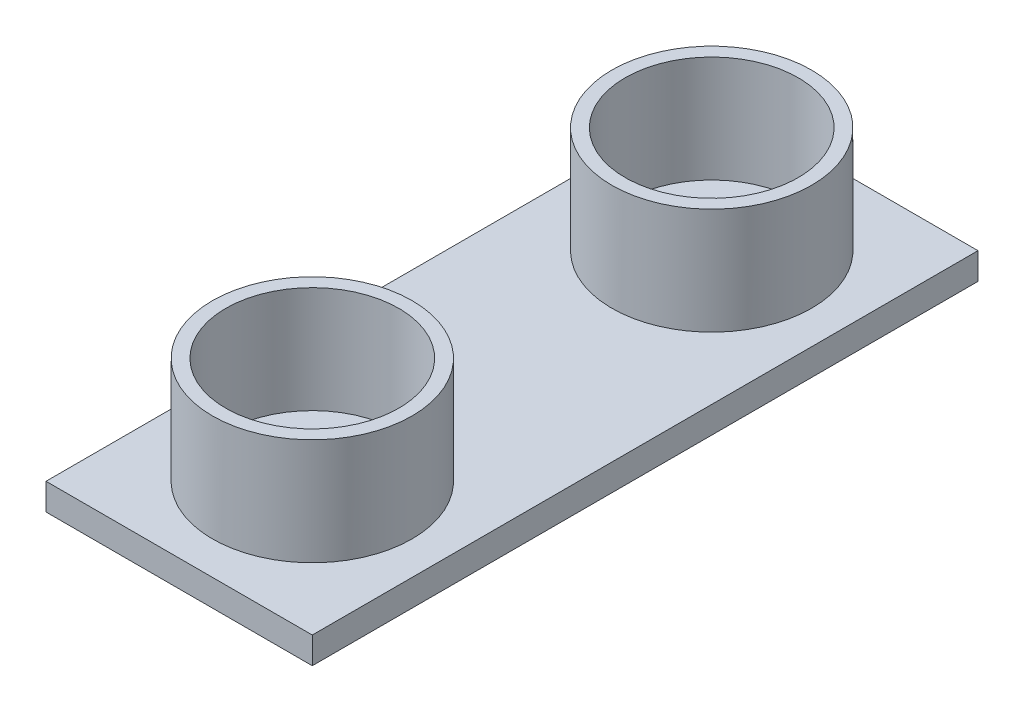
ISO-10303-21;
HEADER;
FILE_DESCRIPTION(('STEP AP214'),'2;1');
FILE_NAME('part.step','',(''),(''),'','','');
FILE_SCHEMA(('AUTOMOTIVE_DESIGN { 1 0 10303 214 1 1 1 1 }'));
ENDSEC;
DATA;
#1=APPLICATION_CONTEXT('core data for automotive mechanical design processes');
#2=APPLICATION_PROTOCOL_DEFINITION('international standard','automotive_design',2000,#1);
#3=PRODUCT_CONTEXT('',#1,'mechanical');
#4=PRODUCT('Part','Part','',(#3));
#5=PRODUCT_RELATED_PRODUCT_CATEGORY('part','',(#4));
#6=PRODUCT_DEFINITION_FORMATION('','',#4);
#7=PRODUCT_DEFINITION_CONTEXT('part definition',#1,'design');
#8=PRODUCT_DEFINITION('design','',#6,#7);
#9=PRODUCT_DEFINITION_SHAPE('','',#8);
#10=(LENGTH_UNIT() NAMED_UNIT(*) SI_UNIT(.MILLI.,.METRE.));
#11=(NAMED_UNIT(*) PLANE_ANGLE_UNIT() SI_UNIT($,.RADIAN.));
#12=(NAMED_UNIT(*) SI_UNIT($,.STERADIAN.) SOLID_ANGLE_UNIT());
#13=UNCERTAINTY_MEASURE_WITH_UNIT(LENGTH_MEASURE(1.E-05),#10,'distance_accuracy_value','');
#14=(GEOMETRIC_REPRESENTATION_CONTEXT(3) GLOBAL_UNCERTAINTY_ASSIGNED_CONTEXT((#13)) GLOBAL_UNIT_ASSIGNED_CONTEXT((#10,
#11,#12)) REPRESENTATION_CONTEXT('',''));
#15=CARTESIAN_POINT('',(0.,0.,0.));
#16=DIRECTION('',(0.,0.,1.));
#17=DIRECTION('',(1.,0.,0.));
#18=AXIS2_PLACEMENT_3D('',#15,#16,#17);
#19=CARTESIAN_POINT('',(-1.,-0.1,5.));
#20=DIRECTION('',(1.,0.,0.));
#21=DIRECTION('',(0.,0.,-1.));
#22=AXIS2_PLACEMENT_3D('',#19,#20,#21);
#23=PLANE('',#22);
#24=DIRECTION('',(0.,-1.,0.));
#25=VECTOR('',#24,1.);
#26=CARTESIAN_POINT('',(-1.,-0.1,0.));
#27=LINE('',#26,#25);
#28=CARTESIAN_POINT('',(-1.,0.0999999999999998,0.));
#29=VERTEX_POINT('',#28);
#30=CARTESIAN_POINT('',(-1.,-0.1,0.));
#31=VERTEX_POINT('',#30);
#32=EDGE_CURVE('E100',#29,#31,#27,.T.);
#33=ORIENTED_EDGE('',*,*,#32,.T.);
#34=DIRECTION('',(0.,0.,-1.));
#35=VECTOR('',#34,1.);
#36=CARTESIAN_POINT('',(-1.,-0.1,5.));
#37=LINE('',#36,#35);
#38=CARTESIAN_POINT('',(-1.,-0.1,5.));
#39=VERTEX_POINT('',#38);
#40=EDGE_CURVE('E91',#39,#31,#37,.T.);
#41=ORIENTED_EDGE('',*,*,#40,.F.);
#42=DIRECTION('',(0.,-1.,0.));
#43=VECTOR('',#42,1.);
#44=CARTESIAN_POINT('',(-1.,-0.1,5.));
#45=LINE('',#44,#43);
#46=CARTESIAN_POINT('',(-1.,0.0999999999999998,5.));
#47=VERTEX_POINT('',#46);
#48=EDGE_CURVE('E85',#47,#39,#45,.T.);
#49=ORIENTED_EDGE('',*,*,#48,.F.);
#50=DIRECTION('',(0.,0.,-1.));
#51=VECTOR('',#50,1.);
#52=CARTESIAN_POINT('',(-1.,0.0999999999999998,5.));
#53=LINE('',#52,#51);
#54=EDGE_CURVE('E96',#47,#29,#53,.T.);
#55=ORIENTED_EDGE('',*,*,#54,.T.);
#56=EDGE_LOOP('',(#33,#41,#49,#55));
#57=FACE_BOUND('',#56,.T.);
#58=ADVANCED_FACE('F33',(#57),#23,.F.);
#59=CARTESIAN_POINT('',(1.,-0.0999999999999999,5.));
#60=DIRECTION('',(0.,1.,0.));
#61=DIRECTION('',(-1.,0.,0.));
#62=AXIS2_PLACEMENT_3D('',#59,#60,#61);
#63=PLANE('',#62);
#64=DIRECTION('',(1.,0.,0.));
#65=VECTOR('',#64,1.);
#66=CARTESIAN_POINT('',(1.,-0.0999999999999999,0.));
#67=LINE('',#66,#65);
#68=CARTESIAN_POINT('',(1.,-0.0999999999999999,0.));
#69=VERTEX_POINT('',#68);
#70=EDGE_CURVE('E90',#31,#69,#67,.T.);
#71=ORIENTED_EDGE('',*,*,#70,.T.);
#72=DIRECTION('',(0.,0.,-1.));
#73=VECTOR('',#72,1.);
#74=CARTESIAN_POINT('',(1.,-0.0999999999999999,5.));
#75=LINE('',#74,#73);
#76=CARTESIAN_POINT('',(1.,-0.0999999999999999,5.));
#77=VERTEX_POINT('',#76);
#78=EDGE_CURVE('E88',#77,#69,#75,.T.);
#79=ORIENTED_EDGE('',*,*,#78,.F.);
#80=DIRECTION('',(1.,0.,0.));
#81=VECTOR('',#80,1.);
#82=CARTESIAN_POINT('',(1.,-0.0999999999999999,5.));
#83=LINE('',#82,#81);
#84=EDGE_CURVE('E80',#39,#77,#83,.T.);
#85=ORIENTED_EDGE('',*,*,#84,.F.);
#86=ORIENTED_EDGE('',*,*,#40,.T.);
#87=EDGE_LOOP('',(#71,#79,#85,#86));
#88=FACE_BOUND('',#87,.T.);
#89=ADVANCED_FACE('F89',(#88),#63,.F.);
#90=CARTESIAN_POINT('',(1.,-0.0999999999999999,5.));
#91=DIRECTION('',(-1.,0.,0.));
#92=DIRECTION('',(0.,0.,1.));
#93=AXIS2_PLACEMENT_3D('',#90,#91,#92);
#94=PLANE('',#93);
#95=DIRECTION('',(0.,1.,0.));
#96=VECTOR('',#95,1.);
#97=CARTESIAN_POINT('',(1.,-0.0999999999999999,0.));
#98=LINE('',#97,#96);
#99=CARTESIAN_POINT('',(1.,0.1,0.));
#100=VERTEX_POINT('',#99);
#101=EDGE_CURVE('E66',#69,#100,#98,.T.);
#102=ORIENTED_EDGE('',*,*,#101,.T.);
#103=DIRECTION('',(0.,0.,-1.));
#104=VECTOR('',#103,1.);
#105=CARTESIAN_POINT('',(1.,0.1,5.));
#106=LINE('',#105,#104);
#107=CARTESIAN_POINT('',(1.,0.1,5.));
#108=VERTEX_POINT('',#107);
#109=EDGE_CURVE('E92',#108,#100,#106,.T.);
#110=ORIENTED_EDGE('',*,*,#109,.F.);
#111=DIRECTION('',(0.,1.,0.));
#112=VECTOR('',#111,1.);
#113=CARTESIAN_POINT('',(1.,-0.0999999999999999,5.));
#114=LINE('',#113,#112);
#115=EDGE_CURVE('E83',#77,#108,#114,.T.);
#116=ORIENTED_EDGE('',*,*,#115,.F.);
#117=ORIENTED_EDGE('',*,*,#78,.T.);
#118=EDGE_LOOP('',(#102,#110,#116,#117));
#119=FACE_BOUND('',#118,.T.);
#120=ADVANCED_FACE('F94',(#119),#94,.F.);
#121=CARTESIAN_POINT('',(1.,0.1,5.));
#122=DIRECTION('',(0.,-1.,0.));
#123=DIRECTION('',(1.,0.,0.));
#124=AXIS2_PLACEMENT_3D('',#121,#122,#123);
#125=PLANE('',#124);
#126=CARTESIAN_POINT('',(0.,0.0999999999999999,4.));
#127=DIRECTION('',(0.,-1.,0.));
#128=DIRECTION('',(1.,0.,0.));
#129=AXIS2_PLACEMENT_3D('',#126,#127,#128);
#130=CIRCLE('',#129,0.75);
#131=CARTESIAN_POINT('',(0.75,0.1,4.));
#132=VERTEX_POINT('',#131);
#133=EDGE_CURVE('E11',#132,#132,#130,.F.);
#134=ORIENTED_EDGE('',*,*,#133,.F.);
#135=EDGE_LOOP('',(#134));
#136=FACE_BOUND('',#135,.T.);
#137=CARTESIAN_POINT('',(0.,0.0999999999999999,1.));
#138=DIRECTION('',(0.,-1.,0.));
#139=DIRECTION('',(1.,0.,0.));
#140=AXIS2_PLACEMENT_3D('',#137,#138,#139);
#141=CIRCLE('',#140,0.75);
#142=CARTESIAN_POINT('',(0.75,0.1,1.));
#143=VERTEX_POINT('',#142);
#144=EDGE_CURVE('E41',#143,#143,#141,.F.);
#145=ORIENTED_EDGE('',*,*,#144,.F.);
#146=EDGE_LOOP('',(#145));
#147=FACE_BOUND('',#146,.T.);
#148=DIRECTION('',(-1.,0.,0.));
#149=VECTOR('',#148,1.);
#150=CARTESIAN_POINT('',(1.,0.1,0.));
#151=LINE('',#150,#149);
#152=EDGE_CURVE('E72',#100,#29,#151,.T.);
#153=ORIENTED_EDGE('',*,*,#152,.T.);
#154=ORIENTED_EDGE('',*,*,#54,.F.);
#155=DIRECTION('',(-1.,0.,0.));
#156=VECTOR('',#155,1.);
#157=CARTESIAN_POINT('',(1.,0.1,5.));
#158=LINE('',#157,#156);
#159=EDGE_CURVE('E49',#108,#47,#158,.T.);
#160=ORIENTED_EDGE('',*,*,#159,.F.);
#161=ORIENTED_EDGE('',*,*,#109,.T.);
#162=EDGE_LOOP('',(#153,#154,#160,#161));
#163=FACE_BOUND('',#162,.T.);
#164=ADVANCED_FACE('F114',(#136,#147,#163),#125,.F.);
#165=CARTESIAN_POINT('',(0.,0.,5.));
#166=DIRECTION('',(0.,0.,1.));
#167=DIRECTION('',(1.,0.,0.));
#168=AXIS2_PLACEMENT_3D('',#165,#166,#167);
#169=PLANE('',#168);
#170=ORIENTED_EDGE('',*,*,#48,.T.);
#171=ORIENTED_EDGE('',*,*,#84,.T.);
#172=ORIENTED_EDGE('',*,*,#115,.T.);
#173=ORIENTED_EDGE('',*,*,#159,.T.);
#174=EDGE_LOOP('',(#170,#171,#172,#173));
#175=FACE_BOUND('',#174,.T.);
#176=ADVANCED_FACE('F81',(#175),#169,.T.);
#177=CARTESIAN_POINT('',(0.,0.,0.));
#178=DIRECTION('',(0.,0.,1.));
#179=DIRECTION('',(1.,0.,0.));
#180=AXIS2_PLACEMENT_3D('',#177,#178,#179);
#181=PLANE('',#180);
#182=ORIENTED_EDGE('',*,*,#32,.F.);
#183=ORIENTED_EDGE('',*,*,#152,.F.);
#184=ORIENTED_EDGE('',*,*,#101,.F.);
#185=ORIENTED_EDGE('',*,*,#70,.F.);
#186=EDGE_LOOP('',(#182,#183,#184,#185));
#187=FACE_BOUND('',#186,.T.);
#188=ADVANCED_FACE('F124',(#187),#181,.F.);
#189=CARTESIAN_POINT('',(0.,0.9,1.));
#190=DIRECTION('',(0.,1.,0.));
#191=DIRECTION('',(-1.,0.,0.));
#192=AXIS2_PLACEMENT_3D('',#189,#190,#191);
#193=PLANE('',#192);
#194=CARTESIAN_POINT('',(0.,0.9,1.));
#195=DIRECTION('',(0.,1.,0.));
#196=DIRECTION('',(-1.,0.,0.));
#197=AXIS2_PLACEMENT_3D('',#194,#195,#196);
#198=CIRCLE('',#197,0.75);
#199=CARTESIAN_POINT('',(-0.75,0.9,1.));
#200=VERTEX_POINT('',#199);
#201=EDGE_CURVE('E103',#200,#200,#198,.T.);
#202=ORIENTED_EDGE('',*,*,#201,.T.);
#203=EDGE_LOOP('',(#202));
#204=FACE_BOUND('',#203,.T.);
#205=CARTESIAN_POINT('',(0.,0.9,1.));
#206=DIRECTION('',(0.,1.,0.));
#207=DIRECTION('',(-1.,0.,0.));
#208=AXIS2_PLACEMENT_3D('',#205,#206,#207);
#209=CIRCLE('',#208,0.65);
#210=CARTESIAN_POINT('',(-0.65,0.9,1.));
#211=VERTEX_POINT('',#210);
#212=EDGE_CURVE('E182',#211,#211,#209,.T.);
#213=ORIENTED_EDGE('',*,*,#212,.F.);
#214=EDGE_LOOP('',(#213));
#215=FACE_BOUND('',#214,.T.);
#216=ADVANCED_FACE('F144',(#204,#215),#193,.T.);
#217=CARTESIAN_POINT('',(0.,0.9,1.));
#218=DIRECTION('',(0.,-1.,0.));
#219=DIRECTION('',(1.,0.,0.));
#220=AXIS2_PLACEMENT_3D('',#217,#218,#219);
#221=CYLINDRICAL_SURFACE('',#220,0.75);
#222=ORIENTED_EDGE('',*,*,#201,.F.);
#223=EDGE_LOOP('',(#222));
#224=FACE_BOUND('',#223,.T.);
#225=ORIENTED_EDGE('',*,*,#144,.T.);
#226=EDGE_LOOP('',(#225));
#227=FACE_BOUND('',#226,.T.);
#228=ADVANCED_FACE('F112',(#224,#227),#221,.T.);
#229=CARTESIAN_POINT('',(0.,0.9,1.));
#230=DIRECTION('',(0.,-1.,0.));
#231=DIRECTION('',(1.,0.,0.));
#232=AXIS2_PLACEMENT_3D('',#229,#230,#231);
#233=CYLINDRICAL_SURFACE('',#232,0.65);
#234=ORIENTED_EDGE('',*,*,#212,.T.);
#235=EDGE_LOOP('',(#234));
#236=FACE_BOUND('',#235,.T.);
#237=CARTESIAN_POINT('',(0.,0.1,1.));
#238=DIRECTION('',(0.,1.,0.));
#239=DIRECTION('',(-1.,0.,0.));
#240=AXIS2_PLACEMENT_3D('',#237,#238,#239);
#241=CIRCLE('',#240,0.65);
#242=CARTESIAN_POINT('',(-0.65,0.0999999999999999,1.));
#243=VERTEX_POINT('',#242);
#244=EDGE_CURVE('E181',#243,#243,#241,.T.);
#245=ORIENTED_EDGE('',*,*,#244,.F.);
#246=EDGE_LOOP('',(#245));
#247=FACE_BOUND('',#246,.T.);
#248=ADVANCED_FACE('F134',(#236,#247),#233,.F.);
#249=ORIENTED_EDGE('',*,*,#244,.T.);
#250=EDGE_LOOP('',(#249));
#251=FACE_BOUND('',#250,.T.);
#252=ADVANCED_FACE('F119',(#251),#125,.F.);
#253=CARTESIAN_POINT('',(0.,0.9,4.));
#254=DIRECTION('',(0.,1.,0.));
#255=DIRECTION('',(-1.,0.,0.));
#256=AXIS2_PLACEMENT_3D('',#253,#254,#255);
#257=PLANE('',#256);
#258=CARTESIAN_POINT('',(0.,0.9,4.));
#259=DIRECTION('',(0.,1.,0.));
#260=DIRECTION('',(-1.,0.,0.));
#261=AXIS2_PLACEMENT_3D('',#258,#259,#260);
#262=CIRCLE('',#261,0.75);
#263=CARTESIAN_POINT('',(-0.75,0.9,4.));
#264=VERTEX_POINT('',#263);
#265=EDGE_CURVE('E176',#264,#264,#262,.T.);
#266=ORIENTED_EDGE('',*,*,#265,.T.);
#267=EDGE_LOOP('',(#266));
#268=FACE_BOUND('',#267,.T.);
#269=CARTESIAN_POINT('',(0.,0.9,4.));
#270=DIRECTION('',(0.,1.,0.));
#271=DIRECTION('',(-1.,0.,0.));
#272=AXIS2_PLACEMENT_3D('',#269,#270,#271);
#273=CIRCLE('',#272,0.65);
#274=CARTESIAN_POINT('',(-0.65,0.9,4.));
#275=VERTEX_POINT('',#274);
#276=EDGE_CURVE('E171',#275,#275,#273,.T.);
#277=ORIENTED_EDGE('',*,*,#276,.F.);
#278=EDGE_LOOP('',(#277));
#279=FACE_BOUND('',#278,.T.);
#280=ADVANCED_FACE('F133',(#268,#279),#257,.T.);
#281=CARTESIAN_POINT('',(0.,0.9,4.));
#282=DIRECTION('',(0.,-1.,0.));
#283=DIRECTION('',(1.,0.,0.));
#284=AXIS2_PLACEMENT_3D('',#281,#282,#283);
#285=CYLINDRICAL_SURFACE('',#284,0.75);
#286=ORIENTED_EDGE('',*,*,#265,.F.);
#287=EDGE_LOOP('',(#286));
#288=FACE_BOUND('',#287,.T.);
#289=ORIENTED_EDGE('',*,*,#133,.T.);
#290=EDGE_LOOP('',(#289));
#291=FACE_BOUND('',#290,.T.);
#292=ADVANCED_FACE('F157',(#288,#291),#285,.T.);
#293=CARTESIAN_POINT('',(0.,0.9,4.));
#294=DIRECTION('',(0.,-1.,0.));
#295=DIRECTION('',(1.,0.,0.));
#296=AXIS2_PLACEMENT_3D('',#293,#294,#295);
#297=CYLINDRICAL_SURFACE('',#296,0.65);
#298=ORIENTED_EDGE('',*,*,#276,.T.);
#299=EDGE_LOOP('',(#298));
#300=FACE_BOUND('',#299,.T.);
#301=CARTESIAN_POINT('',(0.,0.1,4.));
#302=DIRECTION('',(0.,1.,0.));
#303=DIRECTION('',(-1.,0.,0.));
#304=AXIS2_PLACEMENT_3D('',#301,#302,#303);
#305=CIRCLE('',#304,0.65);
#306=CARTESIAN_POINT('',(-0.65,0.0999999999999999,4.));
#307=VERTEX_POINT('',#306);
#308=EDGE_CURVE('E174',#307,#307,#305,.T.);
#309=ORIENTED_EDGE('',*,*,#308,.F.);
#310=EDGE_LOOP('',(#309));
#311=FACE_BOUND('',#310,.T.);
#312=ADVANCED_FACE('F130',(#300,#311),#297,.F.);
#313=ORIENTED_EDGE('',*,*,#308,.T.);
#314=EDGE_LOOP('',(#313));
#315=FACE_BOUND('',#314,.T.);
#316=ADVANCED_FACE('F118',(#315),#125,.F.);
#317=CLOSED_SHELL('',(#58,#89,#120,#164,#176,#188,#216,#228,#248,#252,#280,#292,#312,#316));
#318=MANIFOLD_SOLID_BREP('B2',#317);
#319=ADVANCED_BREP_SHAPE_REPRESENTATION('',(#18,#318),#14);
#320=SHAPE_DEFINITION_REPRESENTATION(#9,#319);
ENDSEC;
END-ISO-10303-21;
